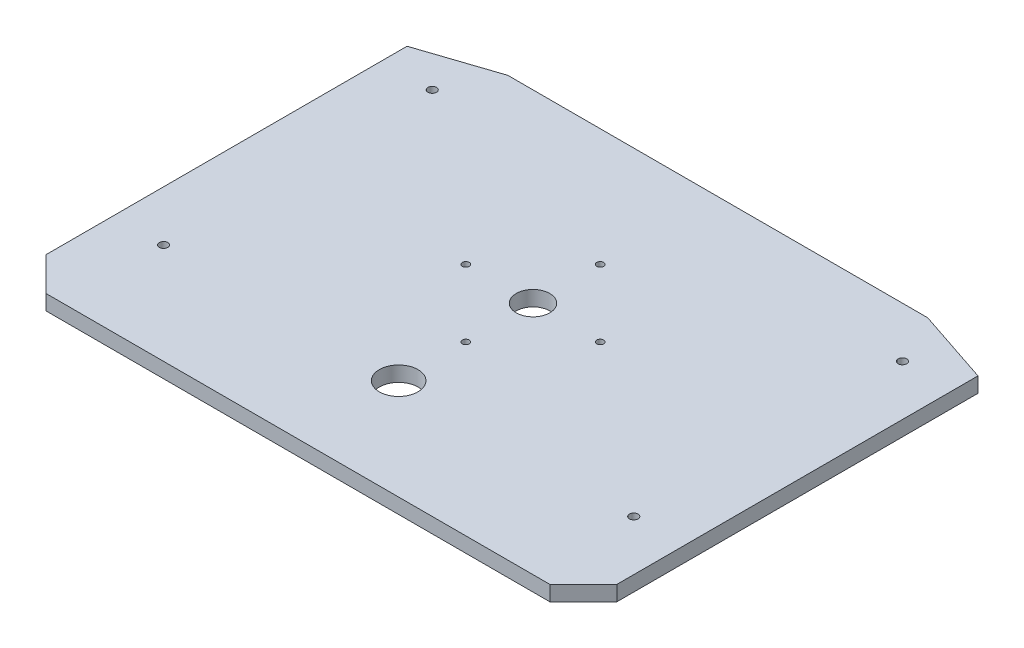
ISO-10303-21;
HEADER;
FILE_DESCRIPTION(('STEP AP214'),'2;1');
FILE_NAME('part.step','',(''),(''),'','','');
FILE_SCHEMA(('AUTOMOTIVE_DESIGN { 1 0 10303 214 1 1 1 1 }'));
ENDSEC;
DATA;
#1=APPLICATION_CONTEXT('core data for automotive mechanical design processes');
#2=APPLICATION_PROTOCOL_DEFINITION('international standard','automotive_design',2000,#1);
#3=PRODUCT_CONTEXT('',#1,'mechanical');
#4=PRODUCT('Part','Part','',(#3));
#5=PRODUCT_RELATED_PRODUCT_CATEGORY('part','',(#4));
#6=PRODUCT_DEFINITION_FORMATION('','',#4);
#7=PRODUCT_DEFINITION_CONTEXT('part definition',#1,'design');
#8=PRODUCT_DEFINITION('design','',#6,#7);
#9=PRODUCT_DEFINITION_SHAPE('','',#8);
#10=(LENGTH_UNIT() NAMED_UNIT(*) SI_UNIT(.MILLI.,.METRE.));
#11=(NAMED_UNIT(*) PLANE_ANGLE_UNIT() SI_UNIT($,.RADIAN.));
#12=(NAMED_UNIT(*) SI_UNIT($,.STERADIAN.) SOLID_ANGLE_UNIT());
#13=UNCERTAINTY_MEASURE_WITH_UNIT(LENGTH_MEASURE(1.E-05),#10,'distance_accuracy_value','');
#14=(GEOMETRIC_REPRESENTATION_CONTEXT(3) GLOBAL_UNCERTAINTY_ASSIGNED_CONTEXT((#13)) GLOBAL_UNIT_ASSIGNED_CONTEXT((#10,
#11,#12)) REPRESENTATION_CONTEXT('',''));
#15=CARTESIAN_POINT('',(0.,0.,0.));
#16=DIRECTION('',(0.,0.,1.));
#17=DIRECTION('',(1.,0.,0.));
#18=AXIS2_PLACEMENT_3D('',#15,#16,#17);
#19=CARTESIAN_POINT('',(-170.,-9.,-95.));
#20=DIRECTION('',(-0.316227766016837,0.,-0.948683298050514));
#21=DIRECTION('',(-0.948683298050514,0.,0.316227766016837));
#22=AXIS2_PLACEMENT_3D('',#19,#20,#21);
#23=PLANE('',#22);
#24=DIRECTION('',(-0.948683298050514,0.,0.316227766016837));
#25=VECTOR('',#24,1.);
#26=CARTESIAN_POINT('',(-170.,0.,-95.));
#27=LINE('',#26,#25);
#28=CARTESIAN_POINT('',(-125.,0.,-110.));
#29=VERTEX_POINT('',#28);
#30=CARTESIAN_POINT('',(-170.,0.,-95.));
#31=VERTEX_POINT('',#30);
#32=EDGE_CURVE('E129',#29,#31,#27,.T.);
#33=ORIENTED_EDGE('',*,*,#32,.F.);
#34=DIRECTION('',(0.,1.,0.));
#35=VECTOR('',#34,1.);
#36=CARTESIAN_POINT('',(-125.,-9.,-110.));
#37=LINE('',#36,#35);
#38=CARTESIAN_POINT('',(-125.,-9.,-110.));
#39=VERTEX_POINT('',#38);
#40=EDGE_CURVE('E11',#39,#29,#37,.T.);
#41=ORIENTED_EDGE('',*,*,#40,.F.);
#42=DIRECTION('',(-0.948683298050514,0.,0.316227766016837));
#43=VECTOR('',#42,1.);
#44=CARTESIAN_POINT('',(-170.,-9.,-95.));
#45=LINE('',#44,#43);
#46=CARTESIAN_POINT('',(-170.,-9.,-95.));
#47=VERTEX_POINT('',#46);
#48=EDGE_CURVE('E150',#39,#47,#45,.T.);
#49=ORIENTED_EDGE('',*,*,#48,.T.);
#50=DIRECTION('',(0.,1.,0.));
#51=VECTOR('',#50,1.);
#52=CARTESIAN_POINT('',(-170.,-9.,-95.));
#53=LINE('',#52,#51);
#54=EDGE_CURVE('E38',#47,#31,#53,.T.);
#55=ORIENTED_EDGE('',*,*,#54,.T.);
#56=EDGE_LOOP('',(#33,#41,#49,#55));
#57=FACE_BOUND('',#56,.T.);
#58=ADVANCED_FACE('F35',(#57),#23,.T.);
#59=CARTESIAN_POINT('',(125.,-9.,-110.));
#60=DIRECTION('',(0.,0.,-1.));
#61=DIRECTION('',(-1.,0.,0.));
#62=AXIS2_PLACEMENT_3D('',#59,#60,#61);
#63=PLANE('',#62);
#64=DIRECTION('',(-1.,0.,0.));
#65=VECTOR('',#64,1.);
#66=CARTESIAN_POINT('',(125.,0.,-110.));
#67=LINE('',#66,#65);
#68=CARTESIAN_POINT('',(125.,0.,-110.));
#69=VERTEX_POINT('',#68);
#70=EDGE_CURVE('E148',#69,#29,#67,.T.);
#71=ORIENTED_EDGE('',*,*,#70,.F.);
#72=DIRECTION('',(0.,1.,0.));
#73=VECTOR('',#72,1.);
#74=CARTESIAN_POINT('',(125.,-9.,-110.));
#75=LINE('',#74,#73);
#76=CARTESIAN_POINT('',(125.,-9.,-110.));
#77=VERTEX_POINT('',#76);
#78=EDGE_CURVE('E44',#77,#69,#75,.T.);
#79=ORIENTED_EDGE('',*,*,#78,.F.);
#80=DIRECTION('',(-1.,0.,0.));
#81=VECTOR('',#80,1.);
#82=CARTESIAN_POINT('',(125.,-9.,-110.));
#83=LINE('',#82,#81);
#84=EDGE_CURVE('E124',#77,#39,#83,.T.);
#85=ORIENTED_EDGE('',*,*,#84,.T.);
#86=ORIENTED_EDGE('',*,*,#40,.T.);
#87=EDGE_LOOP('',(#71,#79,#85,#86));
#88=FACE_BOUND('',#87,.T.);
#89=ADVANCED_FACE('F163',(#88),#63,.T.);
#90=CARTESIAN_POINT('',(170.,-9.,-95.));
#91=DIRECTION('',(0.316227766016837,0.,-0.948683298050514));
#92=DIRECTION('',(-0.948683298050514,0.,-0.316227766016837));
#93=AXIS2_PLACEMENT_3D('',#90,#91,#92);
#94=PLANE('',#93);
#95=DIRECTION('',(-0.948683298050514,0.,-0.316227766016837));
#96=VECTOR('',#95,1.);
#97=CARTESIAN_POINT('',(170.,0.,-95.));
#98=LINE('',#97,#96);
#99=CARTESIAN_POINT('',(170.,0.,-95.));
#100=VERTEX_POINT('',#99);
#101=EDGE_CURVE('E120',#100,#69,#98,.T.);
#102=ORIENTED_EDGE('',*,*,#101,.F.);
#103=DIRECTION('',(0.,1.,0.));
#104=VECTOR('',#103,1.);
#105=CARTESIAN_POINT('',(170.,-9.,-95.));
#106=LINE('',#105,#104);
#107=CARTESIAN_POINT('',(170.,-9.,-95.));
#108=VERTEX_POINT('',#107);
#109=EDGE_CURVE('E108',#108,#100,#106,.T.);
#110=ORIENTED_EDGE('',*,*,#109,.F.);
#111=DIRECTION('',(-0.948683298050514,0.,-0.316227766016837));
#112=VECTOR('',#111,1.);
#113=CARTESIAN_POINT('',(170.,-9.,-95.));
#114=LINE('',#113,#112);
#115=EDGE_CURVE('E115',#108,#77,#114,.T.);
#116=ORIENTED_EDGE('',*,*,#115,.T.);
#117=ORIENTED_EDGE('',*,*,#78,.T.);
#118=EDGE_LOOP('',(#102,#110,#116,#117));
#119=FACE_BOUND('',#118,.T.);
#120=ADVANCED_FACE('F118',(#119),#94,.T.);
#121=CARTESIAN_POINT('',(170.,-9.,0.));
#122=DIRECTION('',(1.,0.,0.));
#123=DIRECTION('',(0.,0.,-1.));
#124=AXIS2_PLACEMENT_3D('',#121,#122,#123);
#125=PLANE('',#124);
#126=DIRECTION('',(0.,0.,-1.));
#127=VECTOR('',#126,1.);
#128=CARTESIAN_POINT('',(170.,0.,0.));
#129=LINE('',#128,#127);
#130=CARTESIAN_POINT('',(170.,0.,120.));
#131=VERTEX_POINT('',#130);
#132=EDGE_CURVE('E145',#131,#100,#129,.T.);
#133=ORIENTED_EDGE('',*,*,#132,.F.);
#134=DIRECTION('',(0.,1.,0.));
#135=VECTOR('',#134,1.);
#136=CARTESIAN_POINT('',(170.,-9.,120.));
#137=LINE('',#136,#135);
#138=CARTESIAN_POINT('',(170.,-9.,120.));
#139=VERTEX_POINT('',#138);
#140=EDGE_CURVE('E110',#139,#131,#137,.T.);
#141=ORIENTED_EDGE('',*,*,#140,.F.);
#142=DIRECTION('',(0.,0.,-1.));
#143=VECTOR('',#142,1.);
#144=CARTESIAN_POINT('',(170.,-9.,120.));
#145=LINE('',#144,#143);
#146=EDGE_CURVE('E105',#139,#108,#145,.T.);
#147=ORIENTED_EDGE('',*,*,#146,.T.);
#148=ORIENTED_EDGE('',*,*,#109,.T.);
#149=EDGE_LOOP('',(#133,#141,#147,#148));
#150=FACE_BOUND('',#149,.T.);
#151=ADVANCED_FACE('F107',(#150),#125,.T.);
#152=CARTESIAN_POINT('',(150.,-9.,140.));
#153=DIRECTION('',(0.707106781186549,0.,0.707106781186546));
#154=DIRECTION('',(0.707106781186546,0.,-0.707106781186549));
#155=AXIS2_PLACEMENT_3D('',#152,#153,#154);
#156=PLANE('',#155);
#157=DIRECTION('',(0.707106781186546,0.,-0.707106781186549));
#158=VECTOR('',#157,1.);
#159=CARTESIAN_POINT('',(150.,0.,140.));
#160=LINE('',#159,#158);
#161=CARTESIAN_POINT('',(150.,0.,140.));
#162=VERTEX_POINT('',#161);
#163=EDGE_CURVE('E142',#162,#131,#160,.T.);
#164=ORIENTED_EDGE('',*,*,#163,.F.);
#165=DIRECTION('',(0.,1.,0.));
#166=VECTOR('',#165,1.);
#167=CARTESIAN_POINT('',(150.,-9.,140.));
#168=LINE('',#167,#166);
#169=CARTESIAN_POINT('',(150.,-9.,140.));
#170=VERTEX_POINT('',#169);
#171=EDGE_CURVE('E154',#170,#162,#168,.T.);
#172=ORIENTED_EDGE('',*,*,#171,.F.);
#173=DIRECTION('',(0.707106781186546,0.,-0.707106781186549));
#174=VECTOR('',#173,1.);
#175=CARTESIAN_POINT('',(150.,-9.,140.));
#176=LINE('',#175,#174);
#177=EDGE_CURVE('E116',#170,#139,#176,.T.);
#178=ORIENTED_EDGE('',*,*,#177,.T.);
#179=ORIENTED_EDGE('',*,*,#140,.T.);
#180=EDGE_LOOP('',(#164,#172,#178,#179));
#181=FACE_BOUND('',#180,.T.);
#182=ADVANCED_FACE('F176',(#181),#156,.T.);
#183=CARTESIAN_POINT('',(120.,-9.,140.));
#184=DIRECTION('',(0.,0.,1.));
#185=DIRECTION('',(1.,0.,0.));
#186=AXIS2_PLACEMENT_3D('',#183,#184,#185);
#187=PLANE('',#186);
#188=DIRECTION('',(1.,0.,0.));
#189=VECTOR('',#188,1.);
#190=CARTESIAN_POINT('',(120.,0.,140.));
#191=LINE('',#190,#189);
#192=CARTESIAN_POINT('',(-150.,0.,140.));
#193=VERTEX_POINT('',#192);
#194=EDGE_CURVE('E139',#193,#162,#191,.T.);
#195=ORIENTED_EDGE('',*,*,#194,.F.);
#196=DIRECTION('',(0.,1.,0.));
#197=VECTOR('',#196,1.);
#198=CARTESIAN_POINT('',(-150.,-9.,140.));
#199=LINE('',#198,#197);
#200=CARTESIAN_POINT('',(-150.,-9.,140.));
#201=VERTEX_POINT('',#200);
#202=EDGE_CURVE('E156',#201,#193,#199,.T.);
#203=ORIENTED_EDGE('',*,*,#202,.F.);
#204=DIRECTION('',(1.,0.,0.));
#205=VECTOR('',#204,1.);
#206=CARTESIAN_POINT('',(-150.,-9.,140.));
#207=LINE('',#206,#205);
#208=EDGE_CURVE('E293',#201,#170,#207,.T.);
#209=ORIENTED_EDGE('',*,*,#208,.T.);
#210=ORIENTED_EDGE('',*,*,#171,.T.);
#211=EDGE_LOOP('',(#195,#203,#209,#210));
#212=FACE_BOUND('',#211,.T.);
#213=ADVANCED_FACE('F179',(#212),#187,.T.);
#214=CARTESIAN_POINT('',(-170.,-9.,120.));
#215=DIRECTION('',(-0.707106781186549,0.,0.707106781186547));
#216=DIRECTION('',(0.707106781186547,0.,0.707106781186549));
#217=AXIS2_PLACEMENT_3D('',#214,#215,#216);
#218=PLANE('',#217);
#219=DIRECTION('',(0.707106781186546,0.,0.707106781186548));
#220=VECTOR('',#219,1.);
#221=CARTESIAN_POINT('',(-170.,0.,120.));
#222=LINE('',#221,#220);
#223=CARTESIAN_POINT('',(-170.,0.,120.));
#224=VERTEX_POINT('',#223);
#225=EDGE_CURVE('E136',#224,#193,#222,.T.);
#226=ORIENTED_EDGE('',*,*,#225,.F.);
#227=DIRECTION('',(0.,1.,0.));
#228=VECTOR('',#227,1.);
#229=CARTESIAN_POINT('',(-170.,-9.,120.));
#230=LINE('',#229,#228);
#231=CARTESIAN_POINT('',(-170.,-9.,120.));
#232=VERTEX_POINT('',#231);
#233=EDGE_CURVE('E158',#232,#224,#230,.T.);
#234=ORIENTED_EDGE('',*,*,#233,.F.);
#235=DIRECTION('',(0.707106781186546,0.,0.707106781186548));
#236=VECTOR('',#235,1.);
#237=CARTESIAN_POINT('',(-170.,-9.,120.));
#238=LINE('',#237,#236);
#239=EDGE_CURVE('E290',#232,#201,#238,.T.);
#240=ORIENTED_EDGE('',*,*,#239,.T.);
#241=ORIENTED_EDGE('',*,*,#202,.T.);
#242=EDGE_LOOP('',(#226,#234,#240,#241));
#243=FACE_BOUND('',#242,.T.);
#244=ADVANCED_FACE('F183',(#243),#218,.T.);
#245=CARTESIAN_POINT('',(-170.,-9.,0.));
#246=DIRECTION('',(-1.,0.,0.));
#247=DIRECTION('',(0.,0.,1.));
#248=AXIS2_PLACEMENT_3D('',#245,#246,#247);
#249=PLANE('',#248);
#250=DIRECTION('',(0.,0.,1.));
#251=VECTOR('',#250,1.);
#252=CARTESIAN_POINT('',(-170.,0.,0.));
#253=LINE('',#252,#251);
#254=EDGE_CURVE('E132',#31,#224,#253,.T.);
#255=ORIENTED_EDGE('',*,*,#254,.F.);
#256=ORIENTED_EDGE('',*,*,#54,.F.);
#257=DIRECTION('',(0.,0.,1.));
#258=VECTOR('',#257,1.);
#259=CARTESIAN_POINT('',(-170.,-9.,-95.));
#260=LINE('',#259,#258);
#261=EDGE_CURVE('E288',#47,#232,#260,.T.);
#262=ORIENTED_EDGE('',*,*,#261,.T.);
#263=ORIENTED_EDGE('',*,*,#233,.T.);
#264=EDGE_LOOP('',(#255,#256,#262,#263));
#265=FACE_BOUND('',#264,.T.);
#266=ADVANCED_FACE('F186',(#265),#249,.T.);
#267=CARTESIAN_POINT('',(0.,-9.,0.));
#268=DIRECTION('',(0.,1.,0.));
#269=DIRECTION('',(0.,0.,1.));
#270=AXIS2_PLACEMENT_3D('',#267,#268,#269);
#271=PLANE('',#270);
#272=CARTESIAN_POINT('',(-39.9999999999987,-9.,1.33041308311872E-12));
#273=DIRECTION('',(0.,1.,0.));
#274=DIRECTION('',(0.,0.,1.));
#275=AXIS2_PLACEMENT_3D('',#272,#273,#274);
#276=CIRCLE('',#275,2.05);
#277=CARTESIAN_POINT('',(-39.9999999999987,-9.,2.05000000000133));
#278=VERTEX_POINT('',#277);
#279=EDGE_CURVE('E262',#278,#278,#276,.T.);
#280=ORIENTED_EDGE('',*,*,#279,.T.);
#281=EDGE_LOOP('',(#280));
#282=FACE_BOUND('',#281,.T.);
#283=CARTESIAN_POINT('',(0.,-9.,80.));
#284=DIRECTION('',(0.,1.,0.));
#285=DIRECTION('',(0.,0.,1.));
#286=AXIS2_PLACEMENT_3D('',#283,#284,#285);
#287=CIRCLE('',#286,11.5);
#288=CARTESIAN_POINT('',(0.,-9.,91.5));
#289=VERTEX_POINT('',#288);
#290=EDGE_CURVE('E253',#289,#289,#287,.T.);
#291=ORIENTED_EDGE('',*,*,#290,.T.);
#292=EDGE_LOOP('',(#291));
#293=FACE_BOUND('',#292,.T.);
#294=CARTESIAN_POINT('',(0.,-9.,-40.));
#295=DIRECTION('',(0.,1.,0.));
#296=DIRECTION('',(0.,0.,1.));
#297=AXIS2_PLACEMENT_3D('',#294,#295,#296);
#298=CIRCLE('',#297,2.05);
#299=CARTESIAN_POINT('',(0.,-9.,-37.95));
#300=VERTEX_POINT('',#299);
#301=EDGE_CURVE('E249',#300,#300,#298,.T.);
#302=ORIENTED_EDGE('',*,*,#301,.T.);
#303=EDGE_LOOP('',(#302));
#304=FACE_BOUND('',#303,.T.);
#305=CARTESIAN_POINT('',(40.0000000000013,-9.,-1.32551449592213E-12));
#306=DIRECTION('',(0.,1.,0.));
#307=DIRECTION('',(0.,0.,1.));
#308=AXIS2_PLACEMENT_3D('',#305,#306,#307);
#309=CIRCLE('',#308,2.05);
#310=CARTESIAN_POINT('',(40.0000000000013,-9.,2.04999999999868));
#311=VERTEX_POINT('',#310);
#312=EDGE_CURVE('E247',#311,#311,#309,.T.);
#313=ORIENTED_EDGE('',*,*,#312,.T.);
#314=EDGE_LOOP('',(#313));
#315=FACE_BOUND('',#314,.T.);
#316=CARTESIAN_POINT('',(2.6596015194383E-12,-9.,40.));
#317=DIRECTION('',(0.,1.,0.));
#318=DIRECTION('',(0.,0.,1.));
#319=AXIS2_PLACEMENT_3D('',#316,#317,#318);
#320=CIRCLE('',#319,2.05);
#321=CARTESIAN_POINT('',(2.6596015194383E-12,-9.,42.05));
#322=VERTEX_POINT('',#321);
#323=EDGE_CURVE('E250',#322,#322,#320,.T.);
#324=ORIENTED_EDGE('',*,*,#323,.T.);
#325=EDGE_LOOP('',(#324));
#326=FACE_BOUND('',#325,.T.);
#327=CARTESIAN_POINT('',(0.,-9.,0.));
#328=DIRECTION('',(0.,1.,0.));
#329=DIRECTION('',(0.,0.,1.));
#330=AXIS2_PLACEMENT_3D('',#327,#328,#329);
#331=CIRCLE('',#330,10.);
#332=CARTESIAN_POINT('',(0.,-9.,10.));
#333=VERTEX_POINT('',#332);
#334=EDGE_CURVE('E256',#333,#333,#331,.T.);
#335=ORIENTED_EDGE('',*,*,#334,.T.);
#336=EDGE_LOOP('',(#335));
#337=FACE_BOUND('',#336,.T.);
#338=CARTESIAN_POINT('',(140.,-9.,-80.));
#339=DIRECTION('',(0.,1.,0.));
#340=DIRECTION('',(0.,0.,-1.));
#341=AXIS2_PLACEMENT_3D('',#338,#339,#340);
#342=CIRCLE('',#341,2.54999999999999);
#343=CARTESIAN_POINT('',(140.,-9.,-82.55));
#344=VERTEX_POINT('',#343);
#345=EDGE_CURVE('E265',#344,#344,#342,.T.);
#346=ORIENTED_EDGE('',*,*,#345,.T.);
#347=EDGE_LOOP('',(#346));
#348=FACE_BOUND('',#347,.T.);
#349=CARTESIAN_POINT('',(140.,-9.,80.));
#350=DIRECTION('',(0.,1.,0.));
#351=DIRECTION('',(0.,0.,1.));
#352=AXIS2_PLACEMENT_3D('',#349,#350,#351);
#353=CIRCLE('',#352,2.54999999999999);
#354=CARTESIAN_POINT('',(140.,-9.,82.55));
#355=VERTEX_POINT('',#354);
#356=EDGE_CURVE('E271',#355,#355,#353,.T.);
#357=ORIENTED_EDGE('',*,*,#356,.T.);
#358=EDGE_LOOP('',(#357));
#359=FACE_BOUND('',#358,.T.);
#360=CARTESIAN_POINT('',(-140.,-9.,80.));
#361=DIRECTION('',(0.,1.,0.));
#362=DIRECTION('',(0.,0.,-1.));
#363=AXIS2_PLACEMENT_3D('',#360,#361,#362);
#364=CIRCLE('',#363,2.54999999999999);
#365=CARTESIAN_POINT('',(-140.,-9.,77.45));
#366=VERTEX_POINT('',#365);
#367=EDGE_CURVE('E277',#366,#366,#364,.T.);
#368=ORIENTED_EDGE('',*,*,#367,.T.);
#369=EDGE_LOOP('',(#368));
#370=FACE_BOUND('',#369,.T.);
#371=CARTESIAN_POINT('',(-140.,-9.,-80.));
#372=DIRECTION('',(0.,1.,0.));
#373=DIRECTION('',(0.,0.,1.));
#374=AXIS2_PLACEMENT_3D('',#371,#372,#373);
#375=CIRCLE('',#374,2.54999999999999);
#376=CARTESIAN_POINT('',(-140.,-9.,-77.45));
#377=VERTEX_POINT('',#376);
#378=EDGE_CURVE('E133',#377,#377,#375,.T.);
#379=ORIENTED_EDGE('',*,*,#378,.T.);
#380=EDGE_LOOP('',(#379));
#381=FACE_BOUND('',#380,.T.);
#382=ORIENTED_EDGE('',*,*,#48,.F.);
#383=ORIENTED_EDGE('',*,*,#84,.F.);
#384=ORIENTED_EDGE('',*,*,#115,.F.);
#385=ORIENTED_EDGE('',*,*,#146,.F.);
#386=ORIENTED_EDGE('',*,*,#177,.F.);
#387=ORIENTED_EDGE('',*,*,#208,.F.);
#388=ORIENTED_EDGE('',*,*,#239,.F.);
#389=ORIENTED_EDGE('',*,*,#261,.F.);
#390=EDGE_LOOP('',(#382,#383,#384,#385,#386,#387,#388,#389));
#391=FACE_BOUND('',#390,.T.);
#392=ADVANCED_FACE('F123',(#282,#293,#304,#315,#326,#337,#348,#359,#370,#381,#391),#271,.F.);
#393=CARTESIAN_POINT('',(0.,0.,0.));
#394=DIRECTION('',(0.,1.,0.));
#395=DIRECTION('',(0.,0.,1.));
#396=AXIS2_PLACEMENT_3D('',#393,#394,#395);
#397=PLANE('',#396);
#398=CARTESIAN_POINT('',(-39.9999999999987,0.,1.33041308311872E-12));
#399=DIRECTION('',(0.,1.,0.));
#400=DIRECTION('',(0.,0.,1.));
#401=AXIS2_PLACEMENT_3D('',#398,#399,#400);
#402=CIRCLE('',#401,2.05);
#403=CARTESIAN_POINT('',(-39.9999999999987,0.,2.05000000000133));
#404=VERTEX_POINT('',#403);
#405=EDGE_CURVE('E335',#404,#404,#402,.T.);
#406=ORIENTED_EDGE('',*,*,#405,.F.);
#407=EDGE_LOOP('',(#406));
#408=FACE_BOUND('',#407,.T.);
#409=CARTESIAN_POINT('',(0.,0.,80.));
#410=DIRECTION('',(0.,1.,0.));
#411=DIRECTION('',(0.,0.,1.));
#412=AXIS2_PLACEMENT_3D('',#409,#410,#411);
#413=CIRCLE('',#412,11.5);
#414=CARTESIAN_POINT('',(0.,0.,91.5));
#415=VERTEX_POINT('',#414);
#416=EDGE_CURVE('E332',#415,#415,#413,.T.);
#417=ORIENTED_EDGE('',*,*,#416,.F.);
#418=EDGE_LOOP('',(#417));
#419=FACE_BOUND('',#418,.T.);
#420=CARTESIAN_POINT('',(0.,0.,-40.));
#421=DIRECTION('',(0.,1.,0.));
#422=DIRECTION('',(0.,0.,1.));
#423=AXIS2_PLACEMENT_3D('',#420,#421,#422);
#424=CIRCLE('',#423,2.05);
#425=CARTESIAN_POINT('',(0.,0.,-37.95));
#426=VERTEX_POINT('',#425);
#427=EDGE_CURVE('E339',#426,#426,#424,.T.);
#428=ORIENTED_EDGE('',*,*,#427,.F.);
#429=EDGE_LOOP('',(#428));
#430=FACE_BOUND('',#429,.T.);
#431=CARTESIAN_POINT('',(40.0000000000013,0.,-1.32551449592213E-12));
#432=DIRECTION('',(0.,1.,0.));
#433=DIRECTION('',(0.,0.,1.));
#434=AXIS2_PLACEMENT_3D('',#431,#432,#433);
#435=CIRCLE('',#434,2.05);
#436=CARTESIAN_POINT('',(40.0000000000013,0.,2.04999999999868));
#437=VERTEX_POINT('',#436);
#438=EDGE_CURVE('E244',#437,#437,#435,.T.);
#439=ORIENTED_EDGE('',*,*,#438,.F.);
#440=EDGE_LOOP('',(#439));
#441=FACE_BOUND('',#440,.T.);
#442=CARTESIAN_POINT('',(2.6596015194383E-12,0.,40.));
#443=DIRECTION('',(0.,1.,0.));
#444=DIRECTION('',(0.,0.,1.));
#445=AXIS2_PLACEMENT_3D('',#442,#443,#444);
#446=CIRCLE('',#445,2.05);
#447=CARTESIAN_POINT('',(2.6596015194383E-12,0.,42.05));
#448=VERTEX_POINT('',#447);
#449=EDGE_CURVE('E338',#448,#448,#446,.T.);
#450=ORIENTED_EDGE('',*,*,#449,.F.);
#451=EDGE_LOOP('',(#450));
#452=FACE_BOUND('',#451,.T.);
#453=CARTESIAN_POINT('',(0.,0.,0.));
#454=DIRECTION('',(0.,1.,0.));
#455=DIRECTION('',(0.,0.,1.));
#456=AXIS2_PLACEMENT_3D('',#453,#454,#455);
#457=CIRCLE('',#456,10.);
#458=CARTESIAN_POINT('',(0.,0.,10.));
#459=VERTEX_POINT('',#458);
#460=EDGE_CURVE('E330',#459,#459,#457,.T.);
#461=ORIENTED_EDGE('',*,*,#460,.F.);
#462=EDGE_LOOP('',(#461));
#463=FACE_BOUND('',#462,.T.);
#464=CARTESIAN_POINT('',(140.,0.,-80.));
#465=DIRECTION('',(0.,1.,0.));
#466=DIRECTION('',(0.,0.,-1.));
#467=AXIS2_PLACEMENT_3D('',#464,#465,#466);
#468=CIRCLE('',#467,2.54999999999999);
#469=CARTESIAN_POINT('',(140.,0.,-82.55));
#470=VERTEX_POINT('',#469);
#471=EDGE_CURVE('E264',#470,#470,#468,.T.);
#472=ORIENTED_EDGE('',*,*,#471,.F.);
#473=EDGE_LOOP('',(#472));
#474=FACE_BOUND('',#473,.T.);
#475=CARTESIAN_POINT('',(140.,0.,80.));
#476=DIRECTION('',(0.,1.,0.));
#477=DIRECTION('',(0.,0.,1.));
#478=AXIS2_PLACEMENT_3D('',#475,#476,#477);
#479=CIRCLE('',#478,2.54999999999999);
#480=CARTESIAN_POINT('',(140.,0.,82.55));
#481=VERTEX_POINT('',#480);
#482=EDGE_CURVE('E268',#481,#481,#479,.T.);
#483=ORIENTED_EDGE('',*,*,#482,.F.);
#484=EDGE_LOOP('',(#483));
#485=FACE_BOUND('',#484,.T.);
#486=CARTESIAN_POINT('',(-140.,0.,80.));
#487=DIRECTION('',(0.,1.,0.));
#488=DIRECTION('',(0.,0.,-1.));
#489=AXIS2_PLACEMENT_3D('',#486,#487,#488);
#490=CIRCLE('',#489,2.54999999999999);
#491=CARTESIAN_POINT('',(-140.,0.,77.45));
#492=VERTEX_POINT('',#491);
#493=EDGE_CURVE('E274',#492,#492,#490,.T.);
#494=ORIENTED_EDGE('',*,*,#493,.F.);
#495=EDGE_LOOP('',(#494));
#496=FACE_BOUND('',#495,.T.);
#497=CARTESIAN_POINT('',(-140.,0.,-80.));
#498=DIRECTION('',(0.,1.,0.));
#499=DIRECTION('',(0.,0.,1.));
#500=AXIS2_PLACEMENT_3D('',#497,#498,#499);
#501=CIRCLE('',#500,2.54999999999999);
#502=CARTESIAN_POINT('',(-140.,0.,-77.45));
#503=VERTEX_POINT('',#502);
#504=EDGE_CURVE('E280',#503,#503,#501,.T.);
#505=ORIENTED_EDGE('',*,*,#504,.F.);
#506=EDGE_LOOP('',(#505));
#507=FACE_BOUND('',#506,.T.);
#508=ORIENTED_EDGE('',*,*,#32,.T.);
#509=ORIENTED_EDGE('',*,*,#254,.T.);
#510=ORIENTED_EDGE('',*,*,#225,.T.);
#511=ORIENTED_EDGE('',*,*,#194,.T.);
#512=ORIENTED_EDGE('',*,*,#163,.T.);
#513=ORIENTED_EDGE('',*,*,#132,.T.);
#514=ORIENTED_EDGE('',*,*,#101,.T.);
#515=ORIENTED_EDGE('',*,*,#70,.T.);
#516=EDGE_LOOP('',(#508,#509,#510,#511,#512,#513,#514,#515));
#517=FACE_BOUND('',#516,.T.);
#518=ADVANCED_FACE('F162',(#408,#419,#430,#441,#452,#463,#474,#485,#496,#507,#517),#397,.T.);
#519=CARTESIAN_POINT('',(-140.,-9.,-80.));
#520=DIRECTION('',(0.,1.,0.));
#521=DIRECTION('',(0.,0.,1.));
#522=AXIS2_PLACEMENT_3D('',#519,#520,#521);
#523=CYLINDRICAL_SURFACE('',#522,2.54999999999999);
#524=ORIENTED_EDGE('',*,*,#378,.F.);
#525=EDGE_LOOP('',(#524));
#526=FACE_BOUND('',#525,.T.);
#527=ORIENTED_EDGE('',*,*,#504,.T.);
#528=EDGE_LOOP('',(#527));
#529=FACE_BOUND('',#528,.T.);
#530=ADVANCED_FACE('F196',(#526,#529),#523,.F.);
#531=CARTESIAN_POINT('',(-140.,-9.,80.));
#532=DIRECTION('',(0.,1.,0.));
#533=DIRECTION('',(0.,0.,1.));
#534=AXIS2_PLACEMENT_3D('',#531,#532,#533);
#535=CYLINDRICAL_SURFACE('',#534,2.54999999999999);
#536=ORIENTED_EDGE('',*,*,#367,.F.);
#537=EDGE_LOOP('',(#536));
#538=FACE_BOUND('',#537,.T.);
#539=ORIENTED_EDGE('',*,*,#493,.T.);
#540=EDGE_LOOP('',(#539));
#541=FACE_BOUND('',#540,.T.);
#542=ADVANCED_FACE('F203',(#538,#541),#535,.F.);
#543=CARTESIAN_POINT('',(140.,-9.,80.));
#544=DIRECTION('',(0.,1.,0.));
#545=DIRECTION('',(0.,0.,1.));
#546=AXIS2_PLACEMENT_3D('',#543,#544,#545);
#547=CYLINDRICAL_SURFACE('',#546,2.54999999999999);
#548=ORIENTED_EDGE('',*,*,#356,.F.);
#549=EDGE_LOOP('',(#548));
#550=FACE_BOUND('',#549,.T.);
#551=ORIENTED_EDGE('',*,*,#482,.T.);
#552=EDGE_LOOP('',(#551));
#553=FACE_BOUND('',#552,.T.);
#554=ADVANCED_FACE('F207',(#550,#553),#547,.F.);
#555=CARTESIAN_POINT('',(140.,-9.,-80.));
#556=DIRECTION('',(0.,1.,0.));
#557=DIRECTION('',(0.,0.,1.));
#558=AXIS2_PLACEMENT_3D('',#555,#556,#557);
#559=CYLINDRICAL_SURFACE('',#558,2.54999999999999);
#560=ORIENTED_EDGE('',*,*,#345,.F.);
#561=EDGE_LOOP('',(#560));
#562=FACE_BOUND('',#561,.T.);
#563=ORIENTED_EDGE('',*,*,#471,.T.);
#564=EDGE_LOOP('',(#563));
#565=FACE_BOUND('',#564,.T.);
#566=ADVANCED_FACE('F211',(#562,#565),#559,.F.);
#567=CARTESIAN_POINT('',(0.,-10.,0.));
#568=DIRECTION('',(0.,1.,0.));
#569=DIRECTION('',(0.,0.,1.));
#570=AXIS2_PLACEMENT_3D('',#567,#568,#569);
#571=CYLINDRICAL_SURFACE('',#570,10.);
#572=ORIENTED_EDGE('',*,*,#460,.T.);
#573=EDGE_LOOP('',(#572));
#574=FACE_BOUND('',#573,.T.);
#575=ORIENTED_EDGE('',*,*,#334,.F.);
#576=EDGE_LOOP('',(#575));
#577=FACE_BOUND('',#576,.T.);
#578=ADVANCED_FACE('F215',(#574,#577),#571,.F.);
#579=CARTESIAN_POINT('',(2.6596015194383E-12,-10.,40.));
#580=DIRECTION('',(0.,1.,0.));
#581=DIRECTION('',(0.,0.,1.));
#582=AXIS2_PLACEMENT_3D('',#579,#580,#581);
#583=CYLINDRICAL_SURFACE('',#582,2.05);
#584=ORIENTED_EDGE('',*,*,#449,.T.);
#585=EDGE_LOOP('',(#584));
#586=FACE_BOUND('',#585,.T.);
#587=ORIENTED_EDGE('',*,*,#323,.F.);
#588=EDGE_LOOP('',(#587));
#589=FACE_BOUND('',#588,.T.);
#590=ADVANCED_FACE('F219',(#586,#589),#583,.F.);
#591=CARTESIAN_POINT('',(40.0000000000013,-10.,-1.32551449592213E-12));
#592=DIRECTION('',(0.,1.,0.));
#593=DIRECTION('',(0.,0.,1.));
#594=AXIS2_PLACEMENT_3D('',#591,#592,#593);
#595=CYLINDRICAL_SURFACE('',#594,2.05);
#596=ORIENTED_EDGE('',*,*,#438,.T.);
#597=EDGE_LOOP('',(#596));
#598=FACE_BOUND('',#597,.T.);
#599=ORIENTED_EDGE('',*,*,#312,.F.);
#600=EDGE_LOOP('',(#599));
#601=FACE_BOUND('',#600,.T.);
#602=ADVANCED_FACE('F229',(#598,#601),#595,.F.);
#603=CARTESIAN_POINT('',(0.,-10.,-40.));
#604=DIRECTION('',(0.,1.,0.));
#605=DIRECTION('',(0.,0.,1.));
#606=AXIS2_PLACEMENT_3D('',#603,#604,#605);
#607=CYLINDRICAL_SURFACE('',#606,2.05);
#608=ORIENTED_EDGE('',*,*,#427,.T.);
#609=EDGE_LOOP('',(#608));
#610=FACE_BOUND('',#609,.T.);
#611=ORIENTED_EDGE('',*,*,#301,.F.);
#612=EDGE_LOOP('',(#611));
#613=FACE_BOUND('',#612,.T.);
#614=ADVANCED_FACE('F226',(#610,#613),#607,.F.);
#615=CARTESIAN_POINT('',(0.,-10.,80.));
#616=DIRECTION('',(0.,1.,0.));
#617=DIRECTION('',(0.,0.,1.));
#618=AXIS2_PLACEMENT_3D('',#615,#616,#617);
#619=CYLINDRICAL_SURFACE('',#618,11.5);
#620=ORIENTED_EDGE('',*,*,#416,.T.);
#621=EDGE_LOOP('',(#620));
#622=FACE_BOUND('',#621,.T.);
#623=ORIENTED_EDGE('',*,*,#290,.F.);
#624=EDGE_LOOP('',(#623));
#625=FACE_BOUND('',#624,.T.);
#626=ADVANCED_FACE('F224',(#622,#625),#619,.F.);
#627=CARTESIAN_POINT('',(-39.9999999999987,-10.,1.33041308311872E-12));
#628=DIRECTION('',(0.,1.,0.));
#629=DIRECTION('',(0.,0.,1.));
#630=AXIS2_PLACEMENT_3D('',#627,#628,#629);
#631=CYLINDRICAL_SURFACE('',#630,2.05);
#632=ORIENTED_EDGE('',*,*,#405,.T.);
#633=EDGE_LOOP('',(#632));
#634=FACE_BOUND('',#633,.T.);
#635=ORIENTED_EDGE('',*,*,#279,.F.);
#636=EDGE_LOOP('',(#635));
#637=FACE_BOUND('',#636,.T.);
#638=ADVANCED_FACE('F221',(#634,#637),#631,.F.);
#639=CLOSED_SHELL('',(#58,#89,#120,#151,#182,#213,#244,#266,#392,#518,#530,#542,#554,#566,#578,
#590,#602,#614,#626,#638));
#640=MANIFOLD_SOLID_BREP('B2',#639);
#641=ADVANCED_BREP_SHAPE_REPRESENTATION('',(#18,#640),#14);
#642=SHAPE_DEFINITION_REPRESENTATION(#9,#641);
ENDSEC;
END-ISO-10303-21;
